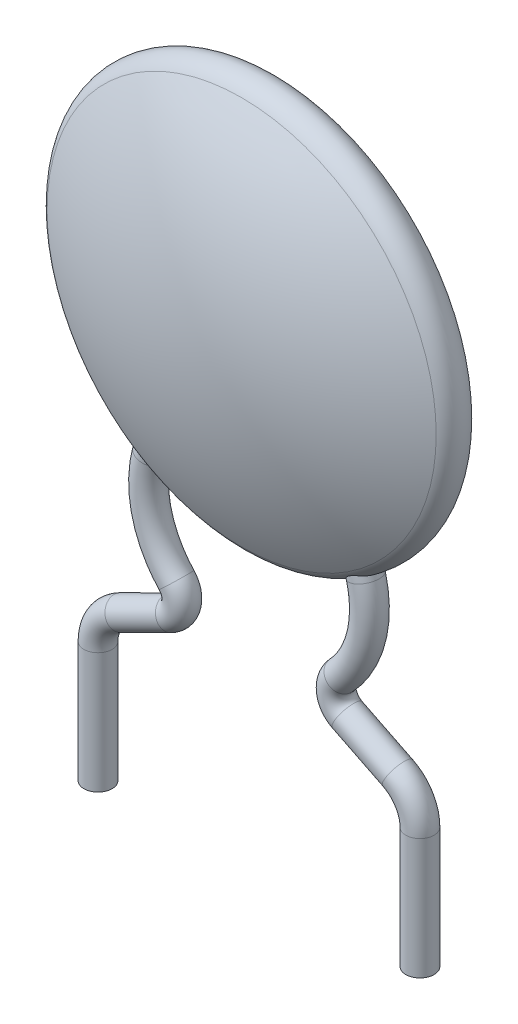
ISO-10303-21;
HEADER;
FILE_DESCRIPTION(('STEP AP214'),'2;1');
FILE_NAME('part.step','',(''),(''),'','','');
FILE_SCHEMA(('AUTOMOTIVE_DESIGN { 1 0 10303 214 1 1 1 1 }'));
ENDSEC;
DATA;
#1=APPLICATION_CONTEXT('core data for automotive mechanical design processes');
#2=APPLICATION_PROTOCOL_DEFINITION('international standard','automotive_design',2000,#1);
#3=PRODUCT_CONTEXT('',#1,'mechanical');
#4=PRODUCT('Part','Part','',(#3));
#5=PRODUCT_RELATED_PRODUCT_CATEGORY('part','',(#4));
#6=PRODUCT_DEFINITION_FORMATION('','',#4);
#7=PRODUCT_DEFINITION_CONTEXT('part definition',#1,'design');
#8=PRODUCT_DEFINITION('design','',#6,#7);
#9=PRODUCT_DEFINITION_SHAPE('','',#8);
#10=(LENGTH_UNIT() NAMED_UNIT(*) SI_UNIT(.MILLI.,.METRE.));
#11=(NAMED_UNIT(*) PLANE_ANGLE_UNIT() SI_UNIT($,.RADIAN.));
#12=(NAMED_UNIT(*) SI_UNIT($,.STERADIAN.) SOLID_ANGLE_UNIT());
#13=UNCERTAINTY_MEASURE_WITH_UNIT(LENGTH_MEASURE(1.E-05),#10,'distance_accuracy_value','');
#14=(GEOMETRIC_REPRESENTATION_CONTEXT(3) GLOBAL_UNCERTAINTY_ASSIGNED_CONTEXT((#13)) GLOBAL_UNIT_ASSIGNED_CONTEXT((#10,
#11,#12)) REPRESENTATION_CONTEXT('',''));
#15=CARTESIAN_POINT('',(0.,0.,0.));
#16=DIRECTION('',(0.,0.,1.));
#17=DIRECTION('',(1.,0.,0.));
#18=AXIS2_PLACEMENT_3D('',#15,#16,#17);
#19=CARTESIAN_POINT('',(0.,0.,0.));
#20=DIRECTION('',(0.,0.,1.));
#21=DIRECTION('',(1.,0.,0.));
#22=AXIS2_PLACEMENT_3D('',#19,#20,#21);
#23=TOROIDAL_SURFACE('',#22,4.58062690656452,0.5);
#24=CARTESIAN_POINT('',(2.39286721075449,-4.42599287590511,-0.216291640849456));
#25=CARTESIAN_POINT('',(2.3988729238866,-4.41709533540636,-0.226647246103084));
#26=CARTESIAN_POINT('',(2.40524867968757,-4.40779655890706,-0.236408503837328));
#27=CARTESIAN_POINT('',(2.41872485103904,-4.38860024476163,-0.254768393538009));
#28=CARTESIAN_POINT('',(2.42582503618365,-4.37870289789709,-0.263367393152179));
#29=CARTESIAN_POINT('',(2.44832285826243,-4.34823653714131,-0.287606913896896));
#30=CARTESIAN_POINT('',(2.46481460765487,-4.32705231355876,-0.301513531870314));
#31=CARTESIAN_POINT('',(2.49578465045254,-4.29091822053615,-0.321235560121304));
#32=CARTESIAN_POINT('',(2.50948255932469,-4.2759238855735,-0.328227670412487));
#33=CARTESIAN_POINT('',(2.53874557892853,-4.24681743007037,-0.339520387648388));
#34=CARTESIAN_POINT('',(2.5543027203266,-4.23270191249762,-0.34383202334735));
#35=CARTESIAN_POINT('',(2.58317614997513,-4.20972734392087,-0.34861213140671));
#36=CARTESIAN_POINT('',(2.59603936074039,-4.2004501985732,-0.349783924914148));
#37=CARTESIAN_POINT('',(2.62274678278237,-4.18339116835257,-0.350161019461463));
#38=CARTESIAN_POINT('',(2.63658964034576,-4.17560727321848,-0.349368984571488));
#39=CARTESIAN_POINT('',(2.664938951731,-4.16183229824433,-0.345657388351932));
#40=CARTESIAN_POINT('',(2.67944768658267,-4.15584800865043,-0.342729908387887));
#41=CARTESIAN_POINT('',(2.70853404541647,-4.14573902480179,-0.334742247769136));
#42=CARTESIAN_POINT('',(2.72311172650049,-4.14161632724391,-0.329679788387293));
#43=CARTESIAN_POINT('',(2.75122782506592,-4.13510669725829,-0.31780417259114));
#44=CARTESIAN_POINT('',(2.76478462776012,-4.13265874237289,-0.311066384737733));
#45=CARTESIAN_POINT('',(2.79109412924215,-4.12890411200662,-0.295923307769463));
#46=CARTESIAN_POINT('',(2.80384660835318,-4.12759774707505,-0.287517565679827));
#47=CARTESIAN_POINT('',(2.83045040949372,-4.12563004990203,-0.267565444648013));
#48=CARTESIAN_POINT('',(2.84409413448331,-4.12512464722404,-0.255726397407866));
#49=CARTESIAN_POINT('',(2.8695356709094,-4.12477434761736,-0.230192364675168));
#50=CARTESIAN_POINT('',(2.8813322573737,-4.12492988710018,-0.216496158703604));
#51=CARTESIAN_POINT('',(2.90404677615208,-4.12558893783417,-0.18574681896549));
#52=CARTESIAN_POINT('',(2.91468755622526,-4.12613211996244,-0.168488047960437));
#53=CARTESIAN_POINT('',(2.93281531559685,-4.12724746098338,-0.132385328669183));
#54=CARTESIAN_POINT('',(2.94030289807254,-4.12781961431066,-0.113541684382606));
#55=CARTESIAN_POINT('',(2.95161629400248,-4.12874101000011,-0.075363872184783));
#56=CARTESIAN_POINT('',(2.9555409779498,-4.12909617540541,-0.0560592769576688));
#57=CARTESIAN_POINT('',(2.95989660733044,-4.12949250407475,-0.0170587880809037));
#58=CARTESIAN_POINT('',(2.96032871579931,-4.12953377186713,0.00263697311924222));
#59=CARTESIAN_POINT('',(2.95775343763264,-4.12929697567706,0.0407188273673537));
#60=CARTESIAN_POINT('',(2.95493167575168,-4.12903614219036,0.0591179297964461));
#61=CARTESIAN_POINT('',(2.94627657453683,-4.12829833316035,0.0951850842943551));
#62=CARTESIAN_POINT('',(2.94044330423167,-4.12782136257128,0.112853153109639));
#63=CARTESIAN_POINT('',(2.92592788880309,-4.12680156135772,0.147189470001739));
#64=CARTESIAN_POINT('',(2.91721642035369,-4.12625809069812,0.163845245269458));
#65=CARTESIAN_POINT('',(2.89727380558974,-4.12535553480257,0.19558597633616));
#66=CARTESIAN_POINT('',(2.88604110175415,-4.12499656399634,0.210669952668597));
#67=CARTESIAN_POINT('',(2.86064403274904,-4.12479946631806,0.2398310785928));
#68=CARTESIAN_POINT('',(2.84634118457773,-4.12499497438682,0.253788011724568));
#69=CARTESIAN_POINT('',(2.81574413416489,-4.12653611049121,0.27924847023827));
#70=CARTESIAN_POINT('',(2.79945071509591,-4.12788128744073,0.290752955655243));
#71=CARTESIAN_POINT('',(2.76848765722809,-4.13202749703985,0.309154333224089));
#72=CARTESIAN_POINT('',(2.75404917560894,-4.13452494284517,0.316507341010317));
#73=CARTESIAN_POINT('',(2.72466152696142,-4.14119510042161,0.329117298641153));
#74=CARTESIAN_POINT('',(2.7097132153765,-4.14536512118982,0.33437758850619));
#75=CARTESIAN_POINT('',(2.67977704483914,-4.15569945697705,0.342678348859491));
#76=CARTESIAN_POINT('',(2.66478943614453,-4.16187485398919,0.345706171070881));
#77=CARTESIAN_POINT('',(2.63547729425364,-4.1761791350842,0.349484143090606));
#78=CARTESIAN_POINT('',(2.62115285027491,-4.18430828110525,0.350233987307497));
#79=CARTESIAN_POINT('',(2.59468162389956,-4.20142643578004,0.349661971419588));
#80=CARTESIAN_POINT('',(2.58245222623264,-4.21029627152379,0.348499560063998));
#81=CARTESIAN_POINT('',(2.55899788758598,-4.22897317606117,0.344601945927208));
#82=CARTESIAN_POINT('',(2.54777421047091,-4.23878139297377,0.341864795378257));
#83=CARTESIAN_POINT('',(2.51953430983575,-4.2653145990368,0.332834120367313));
#84=CARTESIAN_POINT('',(2.50332400525918,-4.28250391771751,0.325386448374608));
#85=CARTESIAN_POINT('',(2.4731053390431,-4.31711039033388,0.307248365639002));
#86=CARTESIAN_POINT('',(2.45910097746576,-4.33452789750714,0.296552164801056));
#87=CARTESIAN_POINT('',(2.43601334121688,-4.3647389418856,0.274819473735207));
#88=CARTESIAN_POINT('',(2.42653484874583,-4.37768406965775,0.264412253990521));
#89=CARTESIAN_POINT('',(2.40879895822757,-4.40263370621943,0.2417474345404));
#90=CARTESIAN_POINT('',(2.40053663324561,-4.4146419121366,0.229497731535925));
#91=CARTESIAN_POINT('',(2.39286721075513,-4.42599287590416,0.216291640850562));
#92=B_SPLINE_CURVE_WITH_KNOTS('',3,(#24,#25,#26,#27,#28,#29,#30,#31,#32,#33,#34,#35,#36,#37,#38,
#39,#40,#41,#42,#43,#44,#45,#46,#47,#48,#49,#50,#51,#52,#53,#54,#55,#56,#57,#58,#59,#60,#61,#62,
#63,#64,#65,#66,#67,#68,#69,#70,#71,#72,#73,#74,#75,#76,#77,#78,#79,#80,#81,#82,#83,#84,#85,#86,
#87,#88,#89,#90,#91),.UNSPECIFIED.,.F.,.F.,(4,2,2,2,2,2,2,2,2,2,2,2,2,2,2,2,2,2,2,2,2,2,2,2,2,2,
2,2,2,2,2,2,2,4),(0.,0.0446833733210293,0.0893525790660042,0.179455837812989,0.243701426045394,
0.307680896727714,0.355201612384683,0.402657898156948,0.45029106122789,0.497975193778554,
0.543813180573346,0.589663632901482,0.643664016401892,0.697700061190216,0.758247232033978,
0.818782815502046,0.877582054679098,0.936361712769246,0.991947309606639,1.04753163238723,
1.10370067641517,1.15990451546209,1.21958928755635,1.27925065237319,1.32823608629644,
1.37714302176745,1.42632495904801,1.47551349380918,1.520804451141,1.56615154888379,
1.64007028195175,1.71412154688605,1.77135091966003,1.82834165639518),.UNSPECIFIED.);
#93=CARTESIAN_POINT('',(2.4111012264278,-4.39946102112052,-0.244376004056198));
#94=VERTEX_POINT('',#93);
#95=CARTESIAN_POINT('',(2.4111012264329,-4.39946102111324,0.244376004063212));
#96=VERTEX_POINT('',#95);
#97=EDGE_CURVE('E76',#94,#96,#92,.T.);
#98=ORIENTED_EDGE('',*,*,#97,.F.);
#99=CARTESIAN_POINT('',(2.90473161734694,-4.12763853836323,-0.179584472442346));
#100=CARTESIAN_POINT('',(2.91483626846113,-4.12800524359942,-0.163692420398567));
#101=CARTESIAN_POINT('',(2.92367732261392,-4.12847530149302,-0.146987419986133));
#102=CARTESIAN_POINT('',(2.9384883658647,-4.12937811296306,-0.112317194707326));
#103=CARTESIAN_POINT('',(2.94445422896686,-4.1298108122025,-0.0943502009198669));
#104=CARTESIAN_POINT('',(2.95323952430121,-4.13047793419098,-0.0576224976227688));
#105=CARTESIAN_POINT('',(2.95605385419643,-4.1307120352612,-0.0388605518947183));
#106=CARTESIAN_POINT('',(2.95837889980209,-4.1309040756189,-0.00113897827124696));
#107=CARTESIAN_POINT('',(2.95789121505245,-4.13086214861833,0.0178205494691708));
#108=CARTESIAN_POINT('',(2.95371061349038,-4.13052167028234,0.054754141412566));
#109=CARTESIAN_POINT('',(2.95012192012909,-4.13023146653027,0.0727402420123618));
#110=CARTESIAN_POINT('',(2.94004045165944,-4.1294968682684,0.107874238814845));
#111=CARTESIAN_POINT('',(2.93354718144788,-4.12905244747424,0.125021991562909));
#112=CARTESIAN_POINT('',(2.91775112160665,-4.12816479165388,0.158419247074671));
#113=CARTESIAN_POINT('',(2.90839081597305,-4.12772178846138,0.174641437925365));
#114=CARTESIAN_POINT('',(2.88725602030815,-4.12710137516424,0.205432845140011));
#115=CARTESIAN_POINT('',(2.87548090388305,-4.12692403407079,0.220001631090035));
#116=CARTESIAN_POINT('',(2.84965022983075,-4.12717986939326,0.247463368392543));
#117=CARTESIAN_POINT('',(2.83555650113779,-4.12762440540582,0.260320315103837));
#118=CARTESIAN_POINT('',(2.80565444641941,-4.12962123786082,0.283788726636624));
#119=CARTESIAN_POINT('',(2.78984489169649,-4.13117433263632,0.294398566050275));
#120=CARTESIAN_POINT('',(2.75688190941678,-4.13601044454244,0.313161929723139));
#121=CARTESIAN_POINT('',(2.73971882078769,-4.13930707970622,0.321295312182845));
#122=CARTESIAN_POINT('',(2.70491254024356,-4.14829657710181,0.334644490670065));
#123=CARTESIAN_POINT('',(2.6872708742982,-4.15398250704038,0.339868626420262));
#124=CARTESIAN_POINT('',(2.65473893794279,-4.16717672028459,0.346705322543371));
#125=CARTESIAN_POINT('',(2.63979234256282,-4.17434630590137,0.348702963757302));
#126=CARTESIAN_POINT('',(2.61083393817331,-4.19058937325249,0.350378207753267));
#127=CARTESIAN_POINT('',(2.59682269638136,-4.1996639966631,0.350054415440791));
#128=CARTESIAN_POINT('',(2.56795954181452,-4.22075864573158,0.347092258426961));
#129=CARTESIAN_POINT('',(2.55332249558954,-4.23301745764884,0.344097562859191));
#130=CARTESIAN_POINT('',(2.52571653674562,-4.25857429043427,0.335721930791192));
#131=CARTESIAN_POINT('',(2.51275261949986,-4.27187524106032,0.330334052512349));
#132=CARTESIAN_POINT('',(2.48351941121468,-4.30404377361759,0.314985002163074));
#133=CARTESIAN_POINT('',(2.46792717283704,-4.32306326490546,0.304060054516146));
#134=CARTESIAN_POINT('',(2.43902888894594,-4.36038072998255,0.278575944996851));
#135=CARTESIAN_POINT('',(2.4257232200933,-4.3786785845166,0.264016185338097));
#136=CARTESIAN_POINT('',(2.4037359856671,-4.40991808999419,0.234547183007618));
#137=CARTESIAN_POINT('',(2.39466197740301,-4.42319864322276,0.220291559584898));
#138=CARTESIAN_POINT('',(2.37808432417966,-4.44785634615608,0.189425819503407));
#139=CARTESIAN_POINT('',(2.37057718264461,-4.45923772236982,0.172821087165402));
#140=CARTESIAN_POINT('',(2.35909441063158,-4.47680071753969,0.141692565486282));
#141=CARTESIAN_POINT('',(2.35470421708885,-4.48357300538917,0.127657310014825));
#142=CARTESIAN_POINT('',(2.34724106302873,-4.49513151841138,0.0984545098870204));
#143=CARTESIAN_POINT('',(2.34416711775209,-4.49991922827237,0.0832878217299077));
#144=CARTESIAN_POINT('',(2.33953827046597,-4.50714076637889,0.0520359035417157));
#145=CARTESIAN_POINT('',(2.33799566700695,-4.50955553546817,0.0359443176374718));
#146=CARTESIAN_POINT('',(2.33661914736692,-4.51170992932022,0.00351228128599689));
#147=CARTESIAN_POINT('',(2.33678424728383,-4.51145109449379,-0.0128280204435523));
#148=CARTESIAN_POINT('',(2.33867961718049,-4.5084856714681,-0.0431774130814112));
#149=CARTESIAN_POINT('',(2.34021838858077,-4.50607857522255,-0.0572296492014674));
#150=CARTESIAN_POINT('',(2.344489028537,-4.4994184282554,-0.0846971803317794));
#151=CARTESIAN_POINT('',(2.34722145459358,-4.49516451497713,-0.0981121744659404));
#152=CARTESIAN_POINT('',(2.35473490365995,-4.48352244725719,-0.128082387958067));
#153=CARTESIAN_POINT('',(2.35988819613327,-4.47557177280504,-0.144324936565265));
#154=CARTESIAN_POINT('',(2.37164286290599,-4.45762782795426,-0.175058670121134));
#155=CARTESIAN_POINT('',(2.37824677741372,-4.4476309765818,-0.189546712810866));
#156=CARTESIAN_POINT('',(2.39517109138173,-4.42242157224247,-0.221459558853102));
#157=CARTESIAN_POINT('',(2.40598417142335,-4.4066063842159,-0.238144559056841));
#158=CARTESIAN_POINT('',(2.42956062839055,-4.37339700062072,-0.268310816463512));
#159=CARTESIAN_POINT('',(2.44232942710637,-4.35599847175628,-0.281782892560077));
#160=CARTESIAN_POINT('',(2.4702582737023,-4.32020305075191,-0.305747596243555));
#161=CARTESIAN_POINT('',(2.48546784702694,-4.30179226755944,-0.316161993228331));
#162=CARTESIAN_POINT('',(2.51852911902491,-4.26563512387299,-0.33319960030757));
#163=CARTESIAN_POINT('',(2.53636887571628,-4.24788619234026,-0.339839319549803));
#164=CARTESIAN_POINT('',(2.56757389322829,-4.2212787362089,-0.346838161088721));
#165=CARTESIAN_POINT('',(2.57995971994542,-4.2116583806764,-0.348638093631194));
#166=CARTESIAN_POINT('',(2.60580798375769,-4.19380440266101,-0.350299818653103));
#167=CARTESIAN_POINT('',(2.61926858820423,-4.18556849096249,-0.350164843094222));
#168=CARTESIAN_POINT('',(2.64701034225513,-4.1708171167475,-0.347793601247206));
#169=CARTESIAN_POINT('',(2.66129486420901,-4.16430944127961,-0.345548024405387));
#170=CARTESIAN_POINT('',(2.69010435221814,-4.15314906456311,-0.338940414440232));
#171=CARTESIAN_POINT('',(2.70462954287058,-4.14849821102869,-0.334576282672586));
#172=CARTESIAN_POINT('',(2.73275329700278,-4.14100791737515,-0.324100821916007));
#173=CARTESIAN_POINT('',(2.746364986703,-4.13809980429731,-0.318071763931165));
#174=CARTESIAN_POINT('',(2.77294225198314,-4.13347743973137,-0.304357424090302));
#175=CARTESIAN_POINT('',(2.78590734243606,-4.13176407248186,-0.296670921045781));
#176=CARTESIAN_POINT('',(2.8131962077394,-4.12897998013698,-0.278240838376291));
#177=CARTESIAN_POINT('',(2.82733384260189,-4.12808445912226,-0.267195184727581));
#178=CARTESIAN_POINT('',(2.85390708963509,-4.1270685151238,-0.243223178083841));
#179=CARTESIAN_POINT('',(2.86634494415467,-4.12694706114141,-0.230299350165684));
#180=CARTESIAN_POINT('',(2.88752608857678,-4.12711210888448,-0.204805732333243));
#181=CARTESIAN_POINT('',(2.89654369552223,-4.1273413926456,-0.19246199570347));
#182=CARTESIAN_POINT('',(2.90473161734694,-4.12763853836323,-0.179584472442346));
#183=B_SPLINE_CURVE_WITH_KNOTS('',3,(#99,#100,#101,#102,#103,#104,#105,#106,#107,#108,#109,#110,
#111,#112,#113,#114,#115,#116,#117,#118,#119,#120,#121,#122,#123,#124,#125,#126,#127,#128,#129,
#130,#131,#132,#133,#134,#135,#136,#137,#138,#139,#140,#141,#142,#143,#144,#145,#146,#147,#148,
#149,#150,#151,#152,#153,#154,#155,#156,#157,#158,#159,#160,#161,#162,#163,#164,#165,#166,#167,
#168,#169,#170,#171,#172,#173,#174,#175,#176,#177,#178,#179,#180,#181,#182),.UNSPECIFIED.,.T.,
.F.,(4,2,2,2,2,2,2,2,2,2,2,2,2,2,2,2,2,2,2,2,2,2,2,2,2,2,2,2,2,2,2,2,2,2,2,2,2,2,2,2,2,4),(0.,
0.0564601665638168,0.113001115878811,0.169633473322869,0.226238399261104,0.281011739266435,
0.335794419288324,0.391757370493001,0.447734856703057,0.504748318990148,0.561802881230393,
0.619309799665166,0.676651007323108,0.726439135807516,0.776257187597358,0.833917479941957,
0.89174612790298,0.972079755417061,1.05242660342815,1.11668675124167,1.18080192737759,
1.22919126044012,1.27754432720028,1.32628266046213,1.37499291444696,1.41781846014052,
1.46066402907726,1.51676652383098,1.57296805508654,1.64878450447532,1.7248150750037,
1.80264863210815,1.88013909989176,1.92731769757584,1.97441749997895,2.02172605508569,
2.06908157005908,2.11442151575081,2.15979498229545,2.21347971052228,2.26709291978962,
2.31284328017415),.UNSPECIFIED.);
#184=EDGE_CURVE('E64',#96,#94,#183,.T.);
#185=ORIENTED_EDGE('',*,*,#184,.F.);
#186=EDGE_LOOP('',(#98,#185));
#187=FACE_BOUND('',#186,.T.);
#188=CARTESIAN_POINT('',(0.,0.,0.43069306930693));
#189=DIRECTION('',(0.,0.,1.));
#190=DIRECTION('',(1.,0.,0.));
#191=AXIS2_PLACEMENT_3D('',#188,#189,#190);
#192=CIRCLE('',#191,4.83460225979978);
#193=CARTESIAN_POINT('',(4.83460225979978,0.,0.43069306930693));
#194=VERTEX_POINT('',#193);
#195=EDGE_CURVE('E129',#194,#194,#192,.T.);
#196=ORIENTED_EDGE('',*,*,#195,.F.);
#197=EDGE_LOOP('',(#196));
#198=FACE_BOUND('',#197,.T.);
#199=CARTESIAN_POINT('',(0.,0.,-0.43069306930693));
#200=DIRECTION('',(0.,0.,1.));
#201=DIRECTION('',(1.,0.,0.));
#202=AXIS2_PLACEMENT_3D('',#199,#200,#201);
#203=CIRCLE('',#202,4.83460225979978);
#204=CARTESIAN_POINT('',(4.83460225979978,0.,-0.43069306930693));
#205=VERTEX_POINT('',#204);
#206=EDGE_CURVE('E125',#205,#205,#203,.T.);
#207=ORIENTED_EDGE('',*,*,#206,.T.);
#208=EDGE_LOOP('',(#207));
#209=FACE_BOUND('',#208,.T.);
#210=CARTESIAN_POINT('',(-2.39286721075513,-4.42599287590416,0.216291640850563));
#211=CARTESIAN_POINT('',(-2.39887292388727,-4.41709533540539,0.226647246104146));
#212=CARTESIAN_POINT('',(-2.40524867968826,-4.40779655890606,0.236408503838347));
#213=CARTESIAN_POINT('',(-2.41872485103978,-4.38860024476059,0.254768393538943));
#214=CARTESIAN_POINT('',(-2.42582503618441,-4.37870289789604,0.26336739315307));
#215=CARTESIAN_POINT('',(-2.44832285826327,-4.34823653714021,0.287606913897663));
#216=CARTESIAN_POINT('',(-2.46481460765576,-4.32705231355765,0.301513531871));
#217=CARTESIAN_POINT('',(-2.49578465045346,-4.29091822053512,0.321235560121806));
#218=CARTESIAN_POINT('',(-2.50948255932558,-4.27592388557256,0.328227670412898));
#219=CARTESIAN_POINT('',(-2.53874557892934,-4.24681743006961,0.339520387648637));
#220=CARTESIAN_POINT('',(-2.55430272032737,-4.23270191249696,0.343832023347529));
#221=CARTESIAN_POINT('',(-2.58317614997586,-4.20972734392033,0.348612131406793));
#222=CARTESIAN_POINT('',(-2.59603936074113,-4.20045019857269,0.349783924914195));
#223=CARTESIAN_POINT('',(-2.62274678278311,-4.18339116835213,0.350161019461438));
#224=CARTESIAN_POINT('',(-2.6365896403465,-4.17560727321809,0.349368984571426));
#225=CARTESIAN_POINT('',(-2.66493895173173,-4.16183229824401,0.345657388351802));
#226=CARTESIAN_POINT('',(-2.67944768658339,-4.15584800865015,0.342729908387724));
#227=CARTESIAN_POINT('',(-2.70853404541715,-4.14573902480158,0.334742247768916));
#228=CARTESIAN_POINT('',(-2.72311172650115,-4.14161632724373,0.329679788387047));
#229=CARTESIAN_POINT('',(-2.75122782506655,-4.13510669725816,0.31780417259084));
#230=CARTESIAN_POINT('',(-2.76478462776076,-4.13265874237279,0.311066384737399));
#231=CARTESIAN_POINT('',(-2.79109412924278,-4.12890411200655,0.295923307769064));
#232=CARTESIAN_POINT('',(-2.80384660835381,-4.12759774707499,0.287517565679397));
#233=CARTESIAN_POINT('',(-2.83045040949434,-4.125630049902,0.267565444647505));
#234=CARTESIAN_POINT('',(-2.84409413448392,-4.12512464722402,0.255726397407312));
#235=CARTESIAN_POINT('',(-2.86953567090999,-4.12477434761737,0.230192364674521));
#236=CARTESIAN_POINT('',(-2.88133225737427,-4.12492988710019,0.216496158702909));
#237=CARTESIAN_POINT('',(-2.90404677615259,-4.12558893783419,0.185746818964712));
#238=CARTESIAN_POINT('',(-2.91468755622573,-4.12613211996246,0.168488047959626));
#239=CARTESIAN_POINT('',(-2.93281531559722,-4.12724746098341,0.132385328668314));
#240=CARTESIAN_POINT('',(-2.94030289807286,-4.12781961431068,0.11354168438171));
#241=CARTESIAN_POINT('',(-2.9516162940027,-4.12874101000013,0.07536387218386));
#242=CARTESIAN_POINT('',(-2.95554097794996,-4.12909617540543,0.0560592769567449));
#243=CARTESIAN_POINT('',(-2.95989660733049,-4.12949250407475,0.0170587880799886));
#244=CARTESIAN_POINT('',(-2.9603287157993,-4.12953377186713,-0.00263697312014785));
#245=CARTESIAN_POINT('',(-2.95775343763253,-4.12929697567705,-0.0407188273682376));
#246=CARTESIAN_POINT('',(-2.95493167575152,-4.12903614219035,-0.0591179297973181));
#247=CARTESIAN_POINT('',(-2.94627657453658,-4.12829833316033,-0.0951850842951963));
#248=CARTESIAN_POINT('',(-2.94044330423137,-4.12782136257126,-0.112853153110461));
#249=CARTESIAN_POINT('',(-2.9259278888027,-4.1268015613577,-0.147189470002527));
#250=CARTESIAN_POINT('',(-2.91721642035326,-4.1262580906981,-0.16384524527023));
#251=CARTESIAN_POINT('',(-2.89727380558922,-4.12535553480255,-0.195585976336894));
#252=CARTESIAN_POINT('',(-2.88604110175359,-4.12499656399632,-0.210669952669309));
#253=CARTESIAN_POINT('',(-2.8606440327484,-4.12479946631807,-0.239831078593461));
#254=CARTESIAN_POINT('',(-2.84634118457705,-4.12499497438683,-0.2537880117252));
#255=CARTESIAN_POINT('',(-2.81574413416413,-4.12653611049126,-0.279248470238837));
#256=CARTESIAN_POINT('',(-2.79945071509512,-4.12788128744081,-0.290752955655774));
#257=CARTESIAN_POINT('',(-2.76848765722727,-4.13202749703999,-0.309154333224529));
#258=CARTESIAN_POINT('',(-2.75404917560813,-4.13452494284532,-0.316507341010707));
#259=CARTESIAN_POINT('',(-2.72466152696064,-4.14119510042181,-0.329117298641447));
#260=CARTESIAN_POINT('',(-2.70971321537574,-4.14536512119005,-0.334377588506438));
#261=CARTESIAN_POINT('',(-2.67977704483843,-4.15569945697733,-0.342678348859651));
#262=CARTESIAN_POINT('',(-2.66478943614384,-4.16187485398949,-0.345706171071001));
#263=CARTESIAN_POINT('',(-2.63547729425302,-4.17617913508453,-0.349484143090653));
#264=CARTESIAN_POINT('',(-2.62115285027434,-4.18430828110559,-0.350233987307512));
#265=CARTESIAN_POINT('',(-2.59468162389903,-4.20142643578041,-0.349661971419551));
#266=CARTESIAN_POINT('',(-2.58245222623212,-4.21029627152418,-0.348499560063937));
#267=CARTESIAN_POINT('',(-2.55899788758548,-4.22897317606159,-0.3446019459271));
#268=CARTESIAN_POINT('',(-2.54777421047043,-4.2387813929742,-0.341864795378126));
#269=CARTESIAN_POINT('',(-2.51953430983527,-4.26531459903728,-0.332834120367117));
#270=CARTESIAN_POINT('',(-2.50332400525869,-4.28250391771804,-0.325386448374367));
#271=CARTESIAN_POINT('',(-2.47310533904261,-4.31711039033447,-0.307248365638661));
#272=CARTESIAN_POINT('',(-2.45910097746527,-4.33452789750775,-0.296552164800661));
#273=CARTESIAN_POINT('',(-2.43601334121636,-4.3647389418863,-0.274819473734668));
#274=CARTESIAN_POINT('',(-2.42653484874528,-4.37768406965852,-0.264412253989885));
#275=CARTESIAN_POINT('',(-2.40879895822696,-4.40263370622031,-0.241747434539546));
#276=CARTESIAN_POINT('',(-2.40053663324498,-4.41464191213752,-0.229497731534951));
#277=CARTESIAN_POINT('',(-2.39286721075449,-4.42599287590511,-0.216291640849456));
#278=B_SPLINE_CURVE_WITH_KNOTS('',3,(#210,#211,#212,#213,#214,#215,#216,#217,#218,#219,#220,
#221,#222,#223,#224,#225,#226,#227,#228,#229,#230,#231,#232,#233,#234,#235,#236,#237,#238,#239,
#240,#241,#242,#243,#244,#245,#246,#247,#248,#249,#250,#251,#252,#253,#254,#255,#256,#257,#258,
#259,#260,#261,#262,#263,#264,#265,#266,#267,#268,#269,#270,#271,#272,#273,#274,#275,#276,#277),
.UNSPECIFIED.,.F.,.F.,(4,2,2,2,2,2,2,2,2,2,2,2,2,2,2,2,2,2,2,2,2,2,2,2,2,2,2,2,2,2,2,2,2,4),(0.,
0.0446833733210199,0.0893525790659863,0.179455837812968,0.243701426045052,0.307680896727048,
0.355201612383964,0.402657898156177,0.450291061227061,0.497975193777667,0.543813180572494,
0.589663632900663,0.643664016401148,0.697700061189547,0.758247232033327,0.818782815501411,
0.877582054678431,0.936361712768548,0.991947309605928,1.04753163238651,1.10370067641446,
1.1599045154614,1.21958928755569,1.27925065237257,1.32823608629574,1.37714302176667,
1.42632495904714,1.47551349380823,1.52080445114007,1.56615154888287,1.64007028195095,
1.71412154688537,1.77135091965969,1.82834165639518),.UNSPECIFIED.);
#279=CARTESIAN_POINT('',(-2.4111012264278,-4.39946102112052,0.244376004056197));
#280=VERTEX_POINT('',#279);
#281=CARTESIAN_POINT('',(-2.41110122644074,-4.39946102110205,-0.244376004074001));
#282=VERTEX_POINT('',#281);
#283=EDGE_CURVE('E11',#280,#282,#278,.T.);
#284=ORIENTED_EDGE('',*,*,#283,.F.);
#285=CARTESIAN_POINT('',(-2.90473161734694,-4.12763853836323,-0.179584472442346));
#286=CARTESIAN_POINT('',(-2.89391718468696,-4.12724513279567,-0.196589880980253));
#287=CARTESIAN_POINT('',(-2.88164301897109,-4.12696911589454,-0.212683351527542));
#288=CARTESIAN_POINT('',(-2.85462388265258,-4.12706009339643,-0.242688975919492));
#289=CARTESIAN_POINT('',(-2.83987359479632,-4.12742848800586,-0.256596308041186));
#290=CARTESIAN_POINT('',(-2.80837142963209,-4.1293658169182,-0.281925391001853));
#291=CARTESIAN_POINT('',(-2.79161451541459,-4.13093782810579,-0.293340674987259));
#292=CARTESIAN_POINT('',(-2.7567454084829,-4.13600845425545,-0.313287927652111));
#293=CARTESIAN_POINT('',(-2.7386365031958,-4.1395025195554,-0.321826628777216));
#294=CARTESIAN_POINT('',(-2.70645139098212,-4.1479704677144,-0.3339551395241));
#295=CARTESIAN_POINT('',(-2.69248727779424,-4.15236347499838,-0.33824688285573));
#296=CARTESIAN_POINT('',(-2.66474858247862,-4.16286082808809,-0.34487458286893));
#297=CARTESIAN_POINT('',(-2.65097377340822,-4.16896289493193,-0.347213127637798));
#298=CARTESIAN_POINT('',(-2.62408797876182,-4.18282417760651,-0.349926393124102));
#299=CARTESIAN_POINT('',(-2.61097686778612,-4.19058307893687,-0.35030148619973));
#300=CARTESIAN_POINT('',(-2.58572999635556,-4.20744687877172,-0.349222460530555));
#301=CARTESIAN_POINT('',(-2.57359546357803,-4.21655343185905,-0.347766076467377));
#302=CARTESIAN_POINT('',(-2.54578387273905,-4.23949326695015,-0.342327258750672));
#303=CARTESIAN_POINT('',(-2.53062332999893,-4.25376350505381,-0.337569199662514));
#304=CARTESIAN_POINT('',(-2.50218872232055,-4.283051954312,-0.325383605024194));
#305=CARTESIAN_POINT('',(-2.48892114013311,-4.29807250870205,-0.317947189530678));
#306=CARTESIAN_POINT('',(-2.46058064894102,-4.33214265652529,-0.298345541923223));
#307=CARTESIAN_POINT('',(-2.44599813182227,-4.35117698116286,-0.285444266149841));
#308=CARTESIAN_POINT('',(-2.41906668094796,-4.38790105227836,-0.255959060034267));
#309=CARTESIAN_POINT('',(-2.40671452201242,-4.40559271846191,-0.23938052577281));
#310=CARTESIAN_POINT('',(-2.38760222543257,-4.43363026887623,-0.207813795770279));
#311=CARTESIAN_POINT('',(-2.38025809743353,-4.44462064162459,-0.193752912027794));
#312=CARTESIAN_POINT('',(-2.3669778070976,-4.46471069017627,-0.163742210875104));
#313=CARTESIAN_POINT('',(-2.36103912032305,-4.47381375224256,-0.147795858611908));
#314=CARTESIAN_POINT('',(-2.35189097332131,-4.48791903745633,-0.117483613403244));
#315=CARTESIAN_POINT('',(-2.34837445289592,-4.49337568265678,-0.103423755965947));
#316=CARTESIAN_POINT('',(-2.34265997274565,-4.50226594776328,-0.0744184811829295));
#317=CARTESIAN_POINT('',(-2.34046101243733,-4.50570110279683,-0.05947374533485));
#318=CARTESIAN_POINT('',(-2.33753925007893,-4.51026874629493,-0.0290006491934113));
#319=CARTESIAN_POINT('',(-2.336824724551,-4.51138832401747,-0.0134695056364959));
#320=CARTESIAN_POINT('',(-2.33696167736758,-4.51117389693037,0.0175682371407718));
#321=CARTESIAN_POINT('',(-2.33781302494617,-4.50984009700208,0.0330748383024235));
#322=CARTESIAN_POINT('',(-2.34086613804745,-4.50506853681877,0.0622273196425416));
#323=CARTESIAN_POINT('',(-2.34294546918457,-4.50182158486005,0.0759185339928367));
#324=CARTESIAN_POINT('',(-2.34821295690622,-4.49362713483681,0.102551762213001));
#325=CARTESIAN_POINT('',(-2.35140154693537,-4.48867897203043,0.115493480907021));
#326=CARTESIAN_POINT('',(-2.36018624310331,-4.47512263287085,0.145389058274164));
#327=CARTESIAN_POINT('',(-2.36623573718196,-4.46584096848964,0.161904041481135));
#328=CARTESIAN_POINT('',(-2.37983406251172,-4.44525507493821,0.19294335694466));
#329=CARTESIAN_POINT('',(-2.38738645608054,-4.43394604675171,0.207462818267363));
#330=CARTESIAN_POINT('',(-2.40646414420763,-4.40596103942057,0.238959767962681));
#331=CARTESIAN_POINT('',(-2.41847722989735,-4.38874719695048,0.255161552200684));
#332=CARTESIAN_POINT('',(-2.44461431381707,-4.35302431572203,0.284070802247647));
#333=CARTESIAN_POINT('',(-2.4587405727894,-4.33451390126563,0.2967744838112));
#334=CARTESIAN_POINT('',(-2.4864586407512,-4.30092526534323,0.3164460216163));
#335=CARTESIAN_POINT('',(-2.49963090866419,-4.2858714875683,0.324047092970382));
#336=CARTESIAN_POINT('',(-2.52786160818729,-4.25645651227041,0.336583533623405));
#337=CARTESIAN_POINT('',(-2.54291440535916,-4.24209341629374,0.341526641360709));
#338=CARTESIAN_POINT('',(-2.57092527357042,-4.21861822011701,0.34738535743736));
#339=CARTESIAN_POINT('',(-2.5834010620121,-4.20911544303636,0.349016312972385));
#340=CARTESIAN_POINT('',(-2.60941088659389,-4.19153242117165,0.35032599555057));
#341=CARTESIAN_POINT('',(-2.62294346527545,-4.18345026550164,0.350007365987298));
#342=CARTESIAN_POINT('',(-2.65077612087875,-4.1690304147182,0.347266013174387));
#343=CARTESIAN_POINT('',(-2.6650788735313,-4.16269934224587,0.344835442179027));
#344=CARTESIAN_POINT('',(-2.69387478892433,-4.15187732944465,0.337873026711155));
#345=CARTESIAN_POINT('',(-2.70836813457041,-4.14738831372711,0.333338994989227));
#346=CARTESIAN_POINT('',(-2.73647333333554,-4.14016104899214,0.322520357846018));
#347=CARTESIAN_POINT('',(-2.75009799602278,-4.13736443649531,0.316306334937872));
#348=CARTESIAN_POINT('',(-2.77666020108112,-4.13294535065953,0.302225404069115));
#349=CARTESIAN_POINT('',(-2.78959751261832,-4.1313232694839,0.294357945174326));
#350=CARTESIAN_POINT('',(-2.81684692129257,-4.1287083723563,0.2754955106418));
#351=CARTESIAN_POINT('',(-2.83096169304565,-4.12789066613029,0.264190702238646));
#352=CARTESIAN_POINT('',(-2.85745391791148,-4.12700522696554,0.239671991475906));
#353=CARTESIAN_POINT('',(-2.86983048778625,-4.12693787395448,0.226457125423259));
#354=CARTESIAN_POINT('',(-2.8932674328946,-4.12720879052732,0.197391679978117));
#355=CARTESIAN_POINT('',(-2.90418234498973,-4.12757477833308,0.181423334899014));
#356=CARTESIAN_POINT('',(-2.92323629207137,-4.12843338378212,0.147909344300345));
#357=CARTESIAN_POINT('',(-2.93137585722128,-4.12892597720889,0.130364000838537));
#358=CARTESIAN_POINT('',(-2.94455478323202,-4.12980756389203,0.0940802178155717));
#359=CARTESIAN_POINT('',(-2.94958550739144,-4.13019626684657,0.0753386126427409));
#360=CARTESIAN_POINT('',(-2.95626453766376,-4.13072532190173,0.0372553847134969));
#361=CARTESIAN_POINT('',(-2.9579132298267,-4.13086570234748,0.0179138306955439));
#362=CARTESIAN_POINT('',(-2.95774926681822,-4.13085228581343,-0.0198832192134951));
#363=CARTESIAN_POINT('',(-2.95608829196029,-4.13071137951477,-0.0383396114311361));
#364=CARTESIAN_POINT('',(-2.94968439024409,-4.13020408152122,-0.0746945646995322));
#365=CARTESIAN_POINT('',(-2.94494376306589,-4.129837858089,-0.0925935315556424));
#366=CARTESIAN_POINT('',(-2.93444171800029,-4.12912854717346,-0.122171944498511));
#367=CARTESIAN_POINT('',(-2.92940489869816,-4.12881105767242,-0.13411598270657));
#368=CARTESIAN_POINT('',(-2.91802324989721,-4.12819241285976,-0.157360212476473));
#369=CARTESIAN_POINT('',(-2.91167861663576,-4.12789125510612,-0.168660500308681));
#370=CARTESIAN_POINT('',(-2.90473161734694,-4.12763853836323,-0.179584472442346));
#371=B_SPLINE_CURVE_WITH_KNOTS('',3,(#285,#286,#287,#288,#289,#290,#291,#292,#293,#294,#295,
#296,#297,#298,#299,#300,#301,#302,#303,#304,#305,#306,#307,#308,#309,#310,#311,#312,#313,#314,
#315,#316,#317,#318,#319,#320,#321,#322,#323,#324,#325,#326,#327,#328,#329,#330,#331,#332,#333,
#334,#335,#336,#337,#338,#339,#340,#341,#342,#343,#344,#345,#346,#347,#348,#349,#350,#351,#352,
#353,#354,#355,#356,#357,#358,#359,#360,#361,#362,#363,#364,#365,#366,#367,#368,#369,#370),
.UNSPECIFIED.,.T.,.F.,(4,2,2,2,2,2,2,2,2,2,2,2,2,2,2,2,2,2,2,2,2,2,2,2,2,2,2,2,2,2,2,2,2,2,2,2,
2,2,2,2,2,2,4),(0.,0.0604230548617514,0.120977562798081,0.181687389213256,0.242254124959673,
0.287819510686118,0.333324423743574,0.378820706723097,0.424373318557187,0.488087714503386,
0.552015326476656,0.633329500420376,0.714525132608192,0.772232238665323,0.829834891522479,
0.876107921383256,0.922345765825898,0.96884072671464,1.01533180498969,1.05782459227561,
1.10033400236826,1.15966496249257,1.21913826662432,1.29828512823356,1.37751727746939,
1.441514106996,1.50532359218318,1.55243906570903,1.5994906707144,1.64671786572553,
1.69399427961789,1.73953043985455,1.7850817971209,1.83917757461664,1.89330074127951,
1.95108137430718,2.00885096354039,2.06678032991181,2.12470308343078,2.18003227948854,
2.23532020679148,2.27414072385299,2.31295542013443),.UNSPECIFIED.);
#372=EDGE_CURVE('E53',#282,#280,#371,.T.);
#373=ORIENTED_EDGE('',*,*,#372,.F.);
#374=EDGE_LOOP('',(#284,#373));
#375=FACE_BOUND('',#374,.T.);
#376=ADVANCED_FACE('F39',(#187,#198,#209,#375),#23,.T.);
#377=CARTESIAN_POINT('',(0.,0.,-7.76785714285715));
#378=DIRECTION('',(0.,0.,1.));
#379=DIRECTION('',(-1.,0.,0.));
#380=AXIS2_PLACEMENT_3D('',#377,#378,#379);
#381=SPHERICAL_SURFACE('',#380,9.51785714285714);
#382=ORIENTED_EDGE('',*,*,#195,.T.);
#383=EDGE_LOOP('',(#382));
#384=FACE_BOUND('',#383,.T.);
#385=ADVANCED_FACE('F174',(#384),#381,.T.);
#386=CARTESIAN_POINT('',(0.,0.,7.76785714285715));
#387=DIRECTION('',(0.,0.,1.));
#388=DIRECTION('',(1.,0.,0.));
#389=AXIS2_PLACEMENT_3D('',#386,#387,#388);
#390=SPHERICAL_SURFACE('',#389,9.51785714285715);
#391=ORIENTED_EDGE('',*,*,#206,.F.);
#392=EDGE_LOOP('',(#391));
#393=FACE_BOUND('',#392,.T.);
#394=ADVANCED_FACE('F172',(#393),#390,.T.);
#395=CARTESIAN_POINT('',(2.03569711987361,-2.08617033896194,0.));
#396=DIRECTION('',(0.26480172843081,-0.964302880126393,0.));
#397=DIRECTION('',(0.964302880126393,0.26480172843081,0.));
#398=AXIS2_PLACEMENT_3D('',#395,#396,#397);
#399=CYLINDRICAL_SURFACE('',#398,0.35);
#400=CARTESIAN_POINT('',(2.6527170619884,-4.33311227095987,0.));
#401=DIRECTION('',(-0.26480172843081,0.964302880126392,0.));
#402=DIRECTION('',(0.,0.,1.));
#403=AXIS2_PLACEMENT_3D('',#400,#401,#402);
#404=CIRCLE('',#403,0.35);
#405=EDGE_CURVE('E101',#96,#94,#404,.T.);
#406=ORIENTED_EDGE('',*,*,#405,.T.);
#407=ORIENTED_EDGE('',*,*,#97,.T.);
#408=EDGE_LOOP('',(#406,#407));
#409=FACE_BOUND('',#408,.T.);
#410=ADVANCED_FACE('F149',(#409),#399,.T.);
#411=CARTESIAN_POINT('',(0.153972842308825,-5.01927820690618,0.));
#412=DIRECTION('',(0.,0.,-1.));
#413=DIRECTION('',(-1.,0.,0.));
#414=AXIS2_PLACEMENT_3D('',#411,#412,#413);
#415=TOROIDAL_SURFACE('',#414,2.59124417356512,0.35);
#416=CARTESIAN_POINT('',(2.04938178387703,-6.78618830967271,0.));
#417=DIRECTION('',(0.68187711555394,0.731466745166066,0.));
#418=DIRECTION('',(0.,0.,1.));
#419=AXIS2_PLACEMENT_3D('',#416,#417,#418);
#420=CIRCLE('',#419,0.35);
#421=CARTESIAN_POINT('',(1.79336842306891,-6.54753131922883,0.));
#422=VERTEX_POINT('',#421);
#423=EDGE_CURVE('E105',#422,#422,#420,.T.);
#424=ORIENTED_EDGE('',*,*,#423,.T.);
#425=EDGE_LOOP('',(#424));
#426=FACE_BOUND('',#425,.T.);
#427=ORIENTED_EDGE('',*,*,#405,.F.);
#428=ORIENTED_EDGE('',*,*,#184,.T.);
#429=EDGE_LOOP('',(#427,#428));
#430=FACE_BOUND('',#429,.T.);
#431=ADVANCED_FACE('F144',(#426,#430),#415,.T.);
#432=CARTESIAN_POINT('',(4.,-12.0806269065645,0.));
#433=DIRECTION('',(0.,1.,0.));
#434=DIRECTION('',(0.,0.,1.));
#435=AXIS2_PLACEMENT_3D('',#432,#433,#434);
#436=PLANE('',#435);
#437=CARTESIAN_POINT('',(4.,-12.0806269065645,0.));
#438=DIRECTION('',(0.,1.,0.));
#439=DIRECTION('',(0.,0.,1.));
#440=AXIS2_PLACEMENT_3D('',#437,#438,#439);
#441=CIRCLE('',#440,0.35);
#442=CARTESIAN_POINT('',(4.,-12.0806269065645,0.35));
#443=VERTEX_POINT('',#442);
#444=EDGE_CURVE('E121',#443,#443,#441,.T.);
#445=ORIENTED_EDGE('',*,*,#444,.F.);
#446=EDGE_LOOP('',(#445));
#447=FACE_BOUND('',#446,.T.);
#448=ADVANCED_FACE('F148',(#447),#436,.F.);
#449=CARTESIAN_POINT('',(2.40947956029543,-7.12187333530682,0.));
#450=DIRECTION('',(0.,0.,1.));
#451=DIRECTION('',(1.,0.,0.));
#452=AXIS2_PLACEMENT_3D('',#449,#450,#451);
#453=TOROIDAL_SURFACE('',#452,0.492295485472336,0.35);
#454=CARTESIAN_POINT('',(2.19070835072797,-7.56288807755568,0.));
#455=DIRECTION('',(-0.89583340750267,0.444390038144595,0.));
#456=DIRECTION('',(0.,0.,1.));
#457=AXIS2_PLACEMENT_3D('',#454,#455,#456);
#458=CIRCLE('',#457,0.35);
#459=CARTESIAN_POINT('',(2.03517183737736,-7.87642977018162,0.));
#460=VERTEX_POINT('',#459);
#461=EDGE_CURVE('E109',#460,#460,#458,.T.);
#462=CARTESIAN_POINT('',(2.40947956029543,-7.12187333530682,0.));
#463=DIRECTION('',(0.,0.,1.));
#464=DIRECTION('',(1.,0.,0.));
#465=AXIS2_PLACEMENT_3D('',#462,#463,#464);
#466=CIRCLE('',#465,0.842295485472336);
#467=EDGE_CURVE('',#422,#460,#466,.T.);
#468=ORIENTED_EDGE('',*,*,#423,.F.);
#469=ORIENTED_EDGE('',*,*,#461,.T.);
#470=ORIENTED_EDGE('',*,*,#467,.T.);
#471=ORIENTED_EDGE('',*,*,#467,.F.);
#472=EDGE_LOOP('',(#468,#470,#469,#471));
#473=FACE_BOUND('',#472,.T.);
#474=ADVANCED_FACE('F154',(#473),#453,.T.);
#475=CARTESIAN_POINT('',(2.19070835072797,-7.56288807755568,0.));
#476=DIRECTION('',(0.89583340750267,-0.444390038144596,0.));
#477=DIRECTION('',(0.444390038144596,0.89583340750267,0.));
#478=AXIS2_PLACEMENT_3D('',#475,#476,#477);
#479=CYLINDRICAL_SURFACE('',#478,0.35);
#480=CARTESIAN_POINT('',(3.4443900381446,-8.18479349906185,0.));
#481=DIRECTION('',(-0.89583340750267,0.444390038144596,0.));
#482=DIRECTION('',(0.,0.,1.));
#483=AXIS2_PLACEMENT_3D('',#480,#481,#482);
#484=CIRCLE('',#483,0.35);
#485=CARTESIAN_POINT('',(3.59992655149521,-7.87125180643592,0.));
#486=VERTEX_POINT('',#485);
#487=EDGE_CURVE('E113',#486,#486,#484,.T.);
#488=ORIENTED_EDGE('',*,*,#487,.T.);
#489=EDGE_LOOP('',(#488));
#490=FACE_BOUND('',#489,.T.);
#491=ORIENTED_EDGE('',*,*,#461,.F.);
#492=EDGE_LOOP('',(#491));
#493=FACE_BOUND('',#492,.T.);
#494=ADVANCED_FACE('F157',(#490,#493),#479,.T.);
#495=CARTESIAN_POINT('',(3.,-9.08062690656452,0.));
#496=DIRECTION('',(0.,0.,-1.));
#497=DIRECTION('',(-1.,0.,0.));
#498=AXIS2_PLACEMENT_3D('',#495,#496,#497);
#499=TOROIDAL_SURFACE('',#498,0.999999999999999,0.35);
#500=CARTESIAN_POINT('',(4.,-9.08062690656452,0.));
#501=DIRECTION('',(0.,1.,0.));
#502=DIRECTION('',(0.,0.,1.));
#503=AXIS2_PLACEMENT_3D('',#500,#501,#502);
#504=CIRCLE('',#503,0.35);
#505=CARTESIAN_POINT('',(4.35,-9.08062690656452,0.));
#506=VERTEX_POINT('',#505);
#507=EDGE_CURVE('E117',#506,#506,#504,.T.);
#508=CARTESIAN_POINT('',(3.,-9.08062690656452,0.));
#509=DIRECTION('',(0.,0.,-1.));
#510=DIRECTION('',(-1.,0.,0.));
#511=AXIS2_PLACEMENT_3D('',#508,#509,#510);
#512=CIRCLE('',#511,1.35);
#513=EDGE_CURVE('',#486,#506,#512,.T.);
#514=ORIENTED_EDGE('',*,*,#487,.F.);
#515=ORIENTED_EDGE('',*,*,#507,.T.);
#516=ORIENTED_EDGE('',*,*,#513,.T.);
#517=ORIENTED_EDGE('',*,*,#513,.F.);
#518=EDGE_LOOP('',(#514,#516,#515,#517));
#519=FACE_BOUND('',#518,.T.);
#520=ADVANCED_FACE('F161',(#519),#499,.T.);
#521=CARTESIAN_POINT('',(4.,-9.08062690656452,0.));
#522=DIRECTION('',(0.,-1.,0.));
#523=DIRECTION('',(0.,0.,-1.));
#524=AXIS2_PLACEMENT_3D('',#521,#522,#523);
#525=CYLINDRICAL_SURFACE('',#524,0.35);
#526=ORIENTED_EDGE('',*,*,#444,.T.);
#527=EDGE_LOOP('',(#526));
#528=FACE_BOUND('',#527,.T.);
#529=ORIENTED_EDGE('',*,*,#507,.F.);
#530=EDGE_LOOP('',(#529));
#531=FACE_BOUND('',#530,.T.);
#532=ADVANCED_FACE('F151',(#528,#531),#525,.T.);
#533=CARTESIAN_POINT('',(-2.03569711987361,-2.08617033896194,0.));
#534=DIRECTION('',(-0.26480172843081,-0.964302880126393,0.));
#535=DIRECTION('',(0.964302880126393,-0.26480172843081,0.));
#536=AXIS2_PLACEMENT_3D('',#533,#534,#535);
#537=CYLINDRICAL_SURFACE('',#536,0.35);
#538=CARTESIAN_POINT('',(-2.6527170619884,-4.33311227095987,0.));
#539=DIRECTION('',(-0.26480172843081,-0.964302880126392,0.));
#540=DIRECTION('',(0.,0.,1.));
#541=AXIS2_PLACEMENT_3D('',#538,#539,#540);
#542=CIRCLE('',#541,0.35);
#543=EDGE_CURVE('E74',#282,#280,#542,.F.);
#544=ORIENTED_EDGE('',*,*,#543,.T.);
#545=ORIENTED_EDGE('',*,*,#283,.T.);
#546=EDGE_LOOP('',(#544,#545));
#547=FACE_BOUND('',#546,.T.);
#548=ADVANCED_FACE('F77',(#547),#537,.T.);
#549=CARTESIAN_POINT('',(-0.153972842308825,-5.01927820690618,0.));
#550=DIRECTION('',(0.,0.,1.));
#551=DIRECTION('',(1.,0.,0.));
#552=AXIS2_PLACEMENT_3D('',#549,#550,#551);
#553=TOROIDAL_SURFACE('',#552,2.59124417356512,0.35);
#554=CARTESIAN_POINT('',(-2.04938178387703,-6.78618830967271,0.));
#555=DIRECTION('',(0.68187711555394,-0.731466745166066,0.));
#556=DIRECTION('',(0.,0.,1.));
#557=AXIS2_PLACEMENT_3D('',#554,#555,#556);
#558=CIRCLE('',#557,0.35);
#559=CARTESIAN_POINT('',(-1.79336842306891,-6.54753131922883,0.));
#560=VERTEX_POINT('',#559);
#561=EDGE_CURVE('E79',#560,#560,#558,.F.);
#562=ORIENTED_EDGE('',*,*,#561,.T.);
#563=EDGE_LOOP('',(#562));
#564=FACE_BOUND('',#563,.T.);
#565=ORIENTED_EDGE('',*,*,#543,.F.);
#566=ORIENTED_EDGE('',*,*,#372,.T.);
#567=EDGE_LOOP('',(#565,#566));
#568=FACE_BOUND('',#567,.T.);
#569=ADVANCED_FACE('F73',(#564,#568),#553,.T.);
#570=CARTESIAN_POINT('',(-4.,-12.0806269065645,0.));
#571=DIRECTION('',(0.,1.,0.));
#572=DIRECTION('',(0.,0.,1.));
#573=AXIS2_PLACEMENT_3D('',#570,#571,#572);
#574=PLANE('',#573);
#575=CARTESIAN_POINT('',(-4.,-12.0806269065645,0.));
#576=DIRECTION('',(0.,-1.,0.));
#577=DIRECTION('',(0.,0.,1.));
#578=AXIS2_PLACEMENT_3D('',#575,#576,#577);
#579=CIRCLE('',#578,0.35);
#580=CARTESIAN_POINT('',(-4.,-12.0806269065645,0.35));
#581=VERTEX_POINT('',#580);
#582=EDGE_CURVE('E97',#581,#581,#579,.F.);
#583=ORIENTED_EDGE('',*,*,#582,.F.);
#584=EDGE_LOOP('',(#583));
#585=FACE_BOUND('',#584,.T.);
#586=ADVANCED_FACE('F231',(#585),#574,.F.);
#587=CARTESIAN_POINT('',(-2.40947956029543,-7.12187333530682,0.));
#588=DIRECTION('',(0.,0.,-1.));
#589=DIRECTION('',(-1.,0.,0.));
#590=AXIS2_PLACEMENT_3D('',#587,#588,#589);
#591=TOROIDAL_SURFACE('',#590,0.492295485472336,0.35);
#592=CARTESIAN_POINT('',(-2.19070835072797,-7.56288807755568,0.));
#593=DIRECTION('',(-0.89583340750267,-0.444390038144595,0.));
#594=DIRECTION('',(0.,0.,1.));
#595=AXIS2_PLACEMENT_3D('',#592,#593,#594);
#596=CIRCLE('',#595,0.35);
#597=CARTESIAN_POINT('',(-2.03517183737736,-7.87642977018162,0.));
#598=VERTEX_POINT('',#597);
#599=EDGE_CURVE('E83',#598,#598,#596,.F.);
#600=CARTESIAN_POINT('',(-2.40947956029543,-7.12187333530682,0.));
#601=DIRECTION('',(0.,0.,-1.));
#602=DIRECTION('',(-1.,0.,0.));
#603=AXIS2_PLACEMENT_3D('',#600,#601,#602);
#604=CIRCLE('',#603,0.842295485472336);
#605=EDGE_CURVE('',#560,#598,#604,.T.);
#606=ORIENTED_EDGE('',*,*,#561,.F.);
#607=ORIENTED_EDGE('',*,*,#599,.T.);
#608=ORIENTED_EDGE('',*,*,#605,.T.);
#609=ORIENTED_EDGE('',*,*,#605,.F.);
#610=EDGE_LOOP('',(#606,#608,#607,#609));
#611=FACE_BOUND('',#610,.T.);
#612=ADVANCED_FACE('F240',(#611),#591,.T.);
#613=CARTESIAN_POINT('',(-2.19070835072797,-7.56288807755568,0.));
#614=DIRECTION('',(-0.89583340750267,-0.444390038144596,0.));
#615=DIRECTION('',(0.444390038144596,-0.89583340750267,0.));
#616=AXIS2_PLACEMENT_3D('',#613,#614,#615);
#617=CYLINDRICAL_SURFACE('',#616,0.35);
#618=CARTESIAN_POINT('',(-3.4443900381446,-8.18479349906185,0.));
#619=DIRECTION('',(-0.89583340750267,-0.444390038144596,0.));
#620=DIRECTION('',(0.,0.,1.));
#621=AXIS2_PLACEMENT_3D('',#618,#619,#620);
#622=CIRCLE('',#621,0.35);
#623=CARTESIAN_POINT('',(-3.59992655149521,-7.87125180643592,0.));
#624=VERTEX_POINT('',#623);
#625=EDGE_CURVE('E89',#624,#624,#622,.F.);
#626=ORIENTED_EDGE('',*,*,#625,.T.);
#627=EDGE_LOOP('',(#626));
#628=FACE_BOUND('',#627,.T.);
#629=ORIENTED_EDGE('',*,*,#599,.F.);
#630=EDGE_LOOP('',(#629));
#631=FACE_BOUND('',#630,.T.);
#632=ADVANCED_FACE('F247',(#628,#631),#617,.T.);
#633=CARTESIAN_POINT('',(-3.,-9.08062690656452,0.));
#634=DIRECTION('',(0.,0.,1.));
#635=DIRECTION('',(1.,0.,0.));
#636=AXIS2_PLACEMENT_3D('',#633,#634,#635);
#637=TOROIDAL_SURFACE('',#636,0.999999999999999,0.35);
#638=CARTESIAN_POINT('',(-4.,-9.08062690656452,0.));
#639=DIRECTION('',(0.,-1.,0.));
#640=DIRECTION('',(0.,0.,1.));
#641=AXIS2_PLACEMENT_3D('',#638,#639,#640);
#642=CIRCLE('',#641,0.35);
#643=CARTESIAN_POINT('',(-4.35,-9.08062690656452,0.));
#644=VERTEX_POINT('',#643);
#645=EDGE_CURVE('E93',#644,#644,#642,.F.);
#646=CARTESIAN_POINT('',(-3.,-9.08062690656452,0.));
#647=DIRECTION('',(0.,0.,1.));
#648=DIRECTION('',(1.,0.,0.));
#649=AXIS2_PLACEMENT_3D('',#646,#647,#648);
#650=CIRCLE('',#649,1.35);
#651=EDGE_CURVE('',#624,#644,#650,.T.);
#652=ORIENTED_EDGE('',*,*,#625,.F.);
#653=ORIENTED_EDGE('',*,*,#645,.T.);
#654=ORIENTED_EDGE('',*,*,#651,.T.);
#655=ORIENTED_EDGE('',*,*,#651,.F.);
#656=EDGE_LOOP('',(#652,#654,#653,#655));
#657=FACE_BOUND('',#656,.T.);
#658=ADVANCED_FACE('F255',(#657),#637,.T.);
#659=CARTESIAN_POINT('',(-4.,-9.08062690656452,0.));
#660=DIRECTION('',(0.,-1.,0.));
#661=DIRECTION('',(0.,0.,-1.));
#662=AXIS2_PLACEMENT_3D('',#659,#660,#661);
#663=CYLINDRICAL_SURFACE('',#662,0.35);
#664=ORIENTED_EDGE('',*,*,#582,.T.);
#665=EDGE_LOOP('',(#664));
#666=FACE_BOUND('',#665,.T.);
#667=ORIENTED_EDGE('',*,*,#645,.F.);
#668=EDGE_LOOP('',(#667));
#669=FACE_BOUND('',#668,.T.);
#670=ADVANCED_FACE('F234',(#666,#669),#663,.T.);
#671=CLOSED_SHELL('',(#376,#385,#394,#410,#431,#448,#474,#494,#520,#532,#548,#569,#586,#612,
#632,#658,#670));
#672=MANIFOLD_SOLID_BREP('B2',#671);
#673=ADVANCED_BREP_SHAPE_REPRESENTATION('',(#18,#672),#14);
#674=SHAPE_DEFINITION_REPRESENTATION(#9,#673);
ENDSEC;
END-ISO-10303-21;
